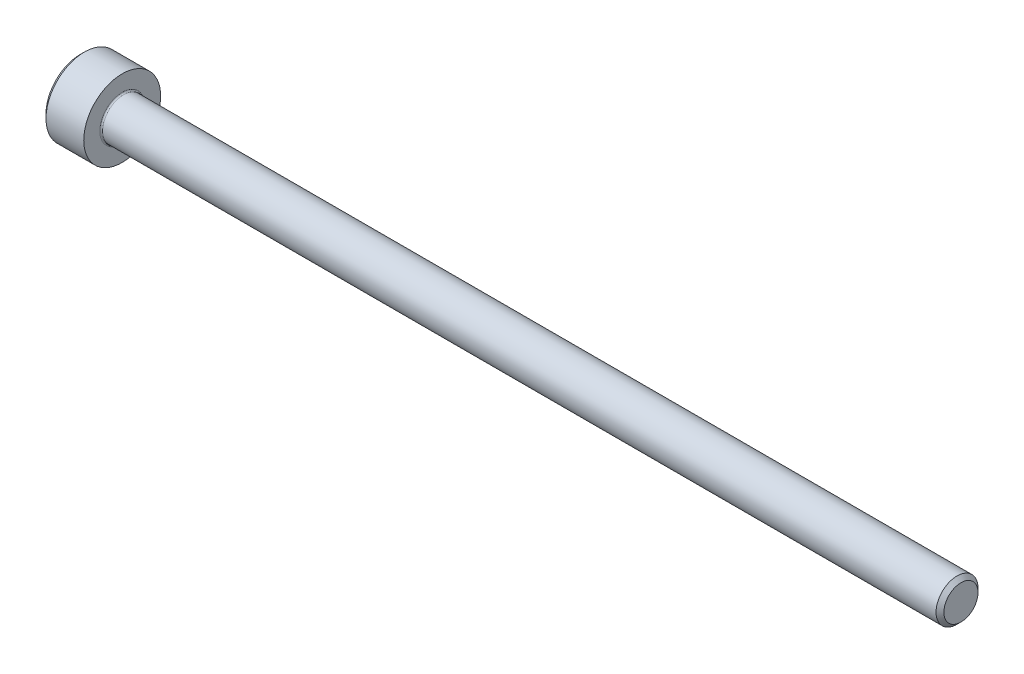
ISO-10303-21;
HEADER;
FILE_DESCRIPTION(('STEP AP214'),'2;1');
FILE_NAME('part.step','',(''),(''),'','','');
FILE_SCHEMA(('AUTOMOTIVE_DESIGN { 1 0 10303 214 1 1 1 1 }'));
ENDSEC;
DATA;
#1=APPLICATION_CONTEXT('core data for automotive mechanical design processes');
#2=APPLICATION_PROTOCOL_DEFINITION('international standard','automotive_design',2000,#1);
#3=PRODUCT_CONTEXT('',#1,'mechanical');
#4=PRODUCT('Part','Part','',(#3));
#5=PRODUCT_RELATED_PRODUCT_CATEGORY('part','',(#4));
#6=PRODUCT_DEFINITION_FORMATION('','',#4);
#7=PRODUCT_DEFINITION_CONTEXT('part definition',#1,'design');
#8=PRODUCT_DEFINITION('design','',#6,#7);
#9=PRODUCT_DEFINITION_SHAPE('','',#8);
#10=(LENGTH_UNIT() NAMED_UNIT(*) SI_UNIT(.MILLI.,.METRE.));
#11=(NAMED_UNIT(*) PLANE_ANGLE_UNIT() SI_UNIT($,.RADIAN.));
#12=(NAMED_UNIT(*) SI_UNIT($,.STERADIAN.) SOLID_ANGLE_UNIT());
#13=UNCERTAINTY_MEASURE_WITH_UNIT(LENGTH_MEASURE(1.E-05),#10,'distance_accuracy_value','');
#14=(GEOMETRIC_REPRESENTATION_CONTEXT(3) GLOBAL_UNCERTAINTY_ASSIGNED_CONTEXT((#13)) GLOBAL_UNIT_ASSIGNED_CONTEXT((#10,
#11,#12)) REPRESENTATION_CONTEXT('',''));
#15=CARTESIAN_POINT('',(0.,0.,0.));
#16=DIRECTION('',(0.,0.,1.));
#17=DIRECTION('',(1.,0.,0.));
#18=AXIS2_PLACEMENT_3D('',#15,#16,#17);
#19=CARTESIAN_POINT('',(0.,0.,0.));
#20=DIRECTION('',(-1.,0.,0.));
#21=DIRECTION('',(0.,0.,1.));
#22=AXIS2_PLACEMENT_3D('',#19,#20,#21);
#23=PLANE('',#22);
#24=DIRECTION('',(0.,-0.499999999999998,0.866025403784439));
#25=VECTOR('',#24,1.);
#26=CARTESIAN_POINT('',(0.,1.47801668912544,0.));
#27=LINE('',#26,#25);
#28=CARTESIAN_POINT('',(0.,1.47801668912544,0.));
#29=VERTEX_POINT('',#28);
#30=CARTESIAN_POINT('',(0.,0.73900834456272,1.28));
#31=VERTEX_POINT('',#30);
#32=EDGE_CURVE('E432',#29,#31,#27,.T.);
#33=ORIENTED_EDGE('',*,*,#32,.T.);
#34=DIRECTION('',(0.,1.,0.));
#35=VECTOR('',#34,1.);
#36=CARTESIAN_POINT('',(0.,-0.739008344562722,1.28));
#37=LINE('',#36,#35);
#38=CARTESIAN_POINT('',(0.,-0.739008344562722,1.28));
#39=VERTEX_POINT('',#38);
#40=EDGE_CURVE('E158',#39,#31,#37,.T.);
#41=ORIENTED_EDGE('',*,*,#40,.F.);
#42=DIRECTION('',(0.,-0.500000000000001,-0.866025403784438));
#43=VECTOR('',#42,1.);
#44=CARTESIAN_POINT('',(0.,-0.739008344562722,1.28));
#45=LINE('',#44,#43);
#46=CARTESIAN_POINT('',(0.,-1.47801668912544,0.));
#47=VERTEX_POINT('',#46);
#48=EDGE_CURVE('E437',#39,#47,#45,.T.);
#49=ORIENTED_EDGE('',*,*,#48,.T.);
#50=DIRECTION('',(0.,0.499999999999998,-0.86602540378444));
#51=VECTOR('',#50,1.);
#52=CARTESIAN_POINT('',(0.,-1.47801668912544,0.));
#53=LINE('',#52,#51);
#54=CARTESIAN_POINT('',(0.,-0.739008344562727,-1.28));
#55=VERTEX_POINT('',#54);
#56=EDGE_CURVE('E441',#47,#55,#53,.T.);
#57=ORIENTED_EDGE('',*,*,#56,.T.);
#58=DIRECTION('',(0.,-1.,0.));
#59=VECTOR('',#58,1.);
#60=CARTESIAN_POINT('',(0.,0.739008344562716,-1.28));
#61=LINE('',#60,#59);
#62=CARTESIAN_POINT('',(0.,0.739008344562716,-1.28));
#63=VERTEX_POINT('',#62);
#64=EDGE_CURVE('E445',#63,#55,#61,.T.);
#65=ORIENTED_EDGE('',*,*,#64,.F.);
#66=DIRECTION('',(0.,-0.500000000000001,-0.866025403784438));
#67=VECTOR('',#66,1.);
#68=CARTESIAN_POINT('',(0.,1.47801668912544,0.));
#69=LINE('',#68,#67);
#70=EDGE_CURVE('E153',#29,#63,#69,.T.);
#71=ORIENTED_EDGE('',*,*,#70,.F.);
#72=EDGE_LOOP('',(#33,#41,#49,#57,#65,#71));
#73=FACE_BOUND('',#72,.T.);
#74=CARTESIAN_POINT('',(0.,0.,0.));
#75=DIRECTION('',(-1.,0.,0.));
#76=DIRECTION('',(0.,0.,1.));
#77=AXIS2_PLACEMENT_3D('',#74,#75,#76);
#78=CIRCLE('',#77,2.45);
#79=CARTESIAN_POINT('',(0.,0.,2.45));
#80=VERTEX_POINT('',#79);
#81=EDGE_CURVE('E173',#80,#80,#78,.T.);
#82=ORIENTED_EDGE('',*,*,#81,.T.);
#83=EDGE_LOOP('',(#82));
#84=FACE_BOUND('',#83,.T.);
#85=ADVANCED_FACE('F40',(#73,#84),#23,.T.);
#86=CARTESIAN_POINT('',(63.,1.2195,0.));
#87=DIRECTION('',(1.,0.,0.));
#88=DIRECTION('',(0.,0.,-1.));
#89=AXIS2_PLACEMENT_3D('',#86,#87,#88);
#90=PLANE('',#89);
#91=CARTESIAN_POINT('',(63.,0.,0.));
#92=DIRECTION('',(-1.,0.,0.));
#93=DIRECTION('',(0.,0.,1.));
#94=AXIS2_PLACEMENT_3D('',#91,#92,#93);
#95=CIRCLE('',#94,1.2195);
#96=CARTESIAN_POINT('',(63.,0.,1.2195));
#97=VERTEX_POINT('',#96);
#98=EDGE_CURVE('E190',#97,#97,#95,.T.);
#99=ORIENTED_EDGE('',*,*,#98,.F.);
#100=EDGE_LOOP('',(#99));
#101=FACE_BOUND('',#100,.T.);
#102=ADVANCED_FACE('F213',(#101),#90,.T.);
#103=CARTESIAN_POINT('',(63.,0.,0.));
#104=DIRECTION('',(-1.,0.,0.));
#105=DIRECTION('',(0.,0.,1.));
#106=AXIS2_PLACEMENT_3D('',#103,#104,#105);
#107=CONICAL_SURFACE('',#106,1.2195,0.785398163396627);
#108=CARTESIAN_POINT('',(62.7194999999998,0.,0.));
#109=DIRECTION('',(-1.,0.,0.));
#110=DIRECTION('',(0.,0.,1.));
#111=AXIS2_PLACEMENT_3D('',#108,#109,#110);
#112=CIRCLE('',#111,1.49999999999976);
#113=CARTESIAN_POINT('',(62.7194999999998,0.,1.49999999999976));
#114=VERTEX_POINT('',#113);
#115=EDGE_CURVE('E186',#114,#114,#112,.T.);
#116=ORIENTED_EDGE('',*,*,#115,.F.);
#117=EDGE_LOOP('',(#116));
#118=FACE_BOUND('',#117,.T.);
#119=ORIENTED_EDGE('',*,*,#98,.T.);
#120=EDGE_LOOP('',(#119));
#121=FACE_BOUND('',#120,.T.);
#122=ADVANCED_FACE('F219',(#118,#121),#107,.T.);
#123=CARTESIAN_POINT('',(-31.75,0.,0.));
#124=DIRECTION('',(-1.,0.,0.));
#125=DIRECTION('',(0.,0.,1.));
#126=AXIS2_PLACEMENT_3D('',#123,#124,#125);
#127=CYLINDRICAL_SURFACE('',#126,1.49999999999988);
#128=CARTESIAN_POINT('',(3.1,0.,0.));
#129=DIRECTION('',(1.,0.,0.));
#130=DIRECTION('',(0.,0.,-1.));
#131=AXIS2_PLACEMENT_3D('',#128,#129,#130);
#132=CIRCLE('',#131,1.49999999999988);
#133=CARTESIAN_POINT('',(3.1,0.,-1.49999999999988));
#134=VERTEX_POINT('',#133);
#135=EDGE_CURVE('E11',#134,#134,#132,.T.);
#136=ORIENTED_EDGE('',*,*,#135,.T.);
#137=EDGE_LOOP('',(#136));
#138=FACE_BOUND('',#137,.T.);
#139=ORIENTED_EDGE('',*,*,#115,.T.);
#140=EDGE_LOOP('',(#139));
#141=FACE_BOUND('',#140,.T.);
#142=ADVANCED_FACE('F230',(#138,#141),#127,.T.);
#143=CARTESIAN_POINT('',(3.,2.75,0.));
#144=DIRECTION('',(1.,0.,0.));
#145=DIRECTION('',(0.,0.,-1.));
#146=AXIS2_PLACEMENT_3D('',#143,#144,#145);
#147=PLANE('',#146);
#148=CARTESIAN_POINT('',(3.,0.,0.));
#149=DIRECTION('',(1.,0.,0.));
#150=DIRECTION('',(0.,0.,-1.));
#151=AXIS2_PLACEMENT_3D('',#148,#149,#150);
#152=CIRCLE('',#151,1.59999999999988);
#153=CARTESIAN_POINT('',(3.,0.,-1.59999999999988));
#154=VERTEX_POINT('',#153);
#155=EDGE_CURVE('E49',#154,#154,#152,.F.);
#156=ORIENTED_EDGE('',*,*,#155,.T.);
#157=EDGE_LOOP('',(#156));
#158=FACE_BOUND('',#157,.T.);
#159=CARTESIAN_POINT('',(3.,0.,0.));
#160=DIRECTION('',(-1.,0.,0.));
#161=DIRECTION('',(0.,0.,1.));
#162=AXIS2_PLACEMENT_3D('',#159,#160,#161);
#163=CIRCLE('',#162,2.75);
#164=CARTESIAN_POINT('',(3.,0.,2.75));
#165=VERTEX_POINT('',#164);
#166=EDGE_CURVE('E182',#165,#165,#163,.T.);
#167=ORIENTED_EDGE('',*,*,#166,.F.);
#168=EDGE_LOOP('',(#167));
#169=FACE_BOUND('',#168,.T.);
#170=ADVANCED_FACE('F197',(#158,#169),#147,.T.);
#171=CARTESIAN_POINT('',(-31.75,0.,0.));
#172=DIRECTION('',(-1.,0.,0.));
#173=DIRECTION('',(0.,0.,1.));
#174=AXIS2_PLACEMENT_3D('',#171,#172,#173);
#175=CYLINDRICAL_SURFACE('',#174,2.75);
#176=ORIENTED_EDGE('',*,*,#166,.T.);
#177=EDGE_LOOP('',(#176));
#178=FACE_BOUND('',#177,.T.);
#179=CARTESIAN_POINT('',(0.300000000000002,0.,0.));
#180=DIRECTION('',(-1.,0.,0.));
#181=DIRECTION('',(0.,0.,1.));
#182=AXIS2_PLACEMENT_3D('',#179,#180,#181);
#183=CIRCLE('',#182,2.75);
#184=CARTESIAN_POINT('',(0.300000000000002,0.,2.75));
#185=VERTEX_POINT('',#184);
#186=EDGE_CURVE('E178',#185,#185,#183,.T.);
#187=ORIENTED_EDGE('',*,*,#186,.F.);
#188=EDGE_LOOP('',(#187));
#189=FACE_BOUND('',#188,.T.);
#190=ADVANCED_FACE('F208',(#178,#189),#175,.T.);
#191=CARTESIAN_POINT('',(0.,0.,0.));
#192=DIRECTION('',(1.,0.,0.));
#193=DIRECTION('',(0.,0.,-1.));
#194=AXIS2_PLACEMENT_3D('',#191,#192,#193);
#195=CONICAL_SURFACE('',#194,2.45,0.785398163397448);
#196=ORIENTED_EDGE('',*,*,#186,.T.);
#197=EDGE_LOOP('',(#196));
#198=FACE_BOUND('',#197,.T.);
#199=ORIENTED_EDGE('',*,*,#81,.F.);
#200=EDGE_LOOP('',(#199));
#201=FACE_BOUND('',#200,.T.);
#202=ADVANCED_FACE('F201',(#198,#201),#195,.T.);
#203=CARTESIAN_POINT('',(3.1,0.,0.));
#204=DIRECTION('',(1.,0.,0.));
#205=DIRECTION('',(0.,0.,-1.));
#206=AXIS2_PLACEMENT_3D('',#203,#204,#205);
#207=TOROIDAL_SURFACE('',#206,1.59999999999988,0.1);
#208=ORIENTED_EDGE('',*,*,#135,.F.);
#209=EDGE_LOOP('',(#208));
#210=FACE_BOUND('',#209,.T.);
#211=ORIENTED_EDGE('',*,*,#155,.F.);
#212=EDGE_LOOP('',(#211));
#213=FACE_BOUND('',#212,.T.);
#214=ADVANCED_FACE('F42',(#210,#213),#207,.F.);
#215=CARTESIAN_POINT('',(1.3,1.47801668912544,0.));
#216=DIRECTION('',(0.,-0.86602540378444,-0.499999999999999));
#217=DIRECTION('',(0.,0.499999999999999,-0.86602540378444));
#218=AXIS2_PLACEMENT_3D('',#215,#216,#217);
#219=PLANE('',#218);
#220=ORIENTED_EDGE('',*,*,#32,.F.);
#221=DIRECTION('',(-1.,0.,0.));
#222=VECTOR('',#221,1.);
#223=CARTESIAN_POINT('',(1.3,1.47801668912544,0.));
#224=LINE('',#223,#222);
#225=CARTESIAN_POINT('',(1.3,1.47801668912544,0.));
#226=VERTEX_POINT('',#225);
#227=EDGE_CURVE('E418',#226,#29,#224,.T.);
#228=ORIENTED_EDGE('',*,*,#227,.F.);
#229=DIRECTION('',(0.,-0.499999999999998,0.866025403784439));
#230=VECTOR('',#229,1.);
#231=CARTESIAN_POINT('',(1.3,1.47801668912544,0.));
#232=LINE('',#231,#230);
#233=CARTESIAN_POINT('',(1.3,1.10851251684408,0.639999999999996));
#234=VERTEX_POINT('',#233);
#235=EDGE_CURVE('E144',#226,#234,#232,.T.);
#236=ORIENTED_EDGE('',*,*,#235,.T.);
#237=CARTESIAN_POINT('',(1.3,0.73900834456272,1.28));
#238=VERTEX_POINT('',#237);
#239=EDGE_CURVE('E134',#234,#238,#232,.T.);
#240=ORIENTED_EDGE('',*,*,#239,.T.);
#241=DIRECTION('',(-1.,0.,0.));
#242=VECTOR('',#241,1.);
#243=CARTESIAN_POINT('',(1.3,0.73900834456272,1.28));
#244=LINE('',#243,#242);
#245=EDGE_CURVE('E149',#238,#31,#244,.T.);
#246=ORIENTED_EDGE('',*,*,#245,.T.);
#247=EDGE_LOOP('',(#220,#228,#236,#240,#246));
#248=FACE_BOUND('',#247,.T.);
#249=ADVANCED_FACE('F148',(#248),#219,.T.);
#250=CARTESIAN_POINT('',(1.3,-0.739008344562722,1.28));
#251=DIRECTION('',(0.,0.,1.));
#252=DIRECTION('',(0.,-1.,0.));
#253=AXIS2_PLACEMENT_3D('',#250,#251,#252);
#254=PLANE('',#253);
#255=ORIENTED_EDGE('',*,*,#40,.T.);
#256=ORIENTED_EDGE('',*,*,#245,.F.);
#257=DIRECTION('',(0.,1.,0.));
#258=VECTOR('',#257,1.);
#259=CARTESIAN_POINT('',(1.3,-0.739008344562722,1.28));
#260=LINE('',#259,#258);
#261=CARTESIAN_POINT('',(1.3,0.,1.28));
#262=VERTEX_POINT('',#261);
#263=EDGE_CURVE('E131',#262,#238,#260,.T.);
#264=ORIENTED_EDGE('',*,*,#263,.F.);
#265=CARTESIAN_POINT('',(1.3,-0.739008344562722,1.28));
#266=VERTEX_POINT('',#265);
#267=EDGE_CURVE('E143',#266,#262,#260,.T.);
#268=ORIENTED_EDGE('',*,*,#267,.F.);
#269=DIRECTION('',(-1.,0.,0.));
#270=VECTOR('',#269,1.);
#271=CARTESIAN_POINT('',(1.3,-0.739008344562722,1.28));
#272=LINE('',#271,#270);
#273=EDGE_CURVE('E161',#266,#39,#272,.T.);
#274=ORIENTED_EDGE('',*,*,#273,.T.);
#275=EDGE_LOOP('',(#255,#256,#264,#268,#274));
#276=FACE_BOUND('',#275,.T.);
#277=ADVANCED_FACE('F155',(#276),#254,.F.);
#278=CARTESIAN_POINT('',(1.3,-0.739008344562722,1.28));
#279=DIRECTION('',(0.,0.866025403784438,-0.500000000000001));
#280=DIRECTION('',(0.,0.500000000000001,0.866025403784438));
#281=AXIS2_PLACEMENT_3D('',#278,#279,#280);
#282=PLANE('',#281);
#283=ORIENTED_EDGE('',*,*,#48,.F.);
#284=ORIENTED_EDGE('',*,*,#273,.F.);
#285=DIRECTION('',(0.,-0.500000000000001,-0.866025403784438));
#286=VECTOR('',#285,1.);
#287=CARTESIAN_POINT('',(1.3,-0.739008344562722,1.28));
#288=LINE('',#287,#286);
#289=CARTESIAN_POINT('',(1.3,-1.10851251684408,0.640000000000002));
#290=VERTEX_POINT('',#289);
#291=EDGE_CURVE('E477',#266,#290,#288,.T.);
#292=ORIENTED_EDGE('',*,*,#291,.T.);
#293=CARTESIAN_POINT('',(1.3,-1.47801668912544,0.));
#294=VERTEX_POINT('',#293);
#295=EDGE_CURVE('E460',#290,#294,#288,.T.);
#296=ORIENTED_EDGE('',*,*,#295,.T.);
#297=DIRECTION('',(-1.,0.,0.));
#298=VECTOR('',#297,1.);
#299=CARTESIAN_POINT('',(1.3,-1.47801668912544,0.));
#300=LINE('',#299,#298);
#301=EDGE_CURVE('E168',#294,#47,#300,.T.);
#302=ORIENTED_EDGE('',*,*,#301,.T.);
#303=EDGE_LOOP('',(#283,#284,#292,#296,#302));
#304=FACE_BOUND('',#303,.T.);
#305=ADVANCED_FACE('F307',(#304),#282,.T.);
#306=CARTESIAN_POINT('',(1.3,-1.47801668912544,0.));
#307=DIRECTION('',(0.,0.86602540378444,0.499999999999998));
#308=DIRECTION('',(0.,-0.499999999999998,0.86602540378444));
#309=AXIS2_PLACEMENT_3D('',#306,#307,#308);
#310=PLANE('',#309);
#311=ORIENTED_EDGE('',*,*,#56,.F.);
#312=ORIENTED_EDGE('',*,*,#301,.F.);
#313=DIRECTION('',(0.,0.499999999999998,-0.86602540378444));
#314=VECTOR('',#313,1.);
#315=CARTESIAN_POINT('',(1.3,-1.47801668912544,0.));
#316=LINE('',#315,#314);
#317=CARTESIAN_POINT('',(1.3,-1.10851251684409,-0.64));
#318=VERTEX_POINT('',#317);
#319=EDGE_CURVE('E427',#294,#318,#316,.T.);
#320=ORIENTED_EDGE('',*,*,#319,.T.);
#321=CARTESIAN_POINT('',(1.3,-0.739008344562727,-1.28));
#322=VERTEX_POINT('',#321);
#323=EDGE_CURVE('E475',#318,#322,#316,.T.);
#324=ORIENTED_EDGE('',*,*,#323,.T.);
#325=DIRECTION('',(-1.,0.,0.));
#326=VECTOR('',#325,1.);
#327=CARTESIAN_POINT('',(1.3,-0.739008344562727,-1.28));
#328=LINE('',#327,#326);
#329=EDGE_CURVE('E417',#322,#55,#328,.T.);
#330=ORIENTED_EDGE('',*,*,#329,.T.);
#331=EDGE_LOOP('',(#311,#312,#320,#324,#330));
#332=FACE_BOUND('',#331,.T.);
#333=ADVANCED_FACE('F315',(#332),#310,.T.);
#334=CARTESIAN_POINT('',(1.3,0.739008344562716,-1.28));
#335=DIRECTION('',(0.,0.,-1.));
#336=DIRECTION('',(0.,1.,0.));
#337=AXIS2_PLACEMENT_3D('',#334,#335,#336);
#338=PLANE('',#337);
#339=ORIENTED_EDGE('',*,*,#64,.T.);
#340=ORIENTED_EDGE('',*,*,#329,.F.);
#341=DIRECTION('',(0.,-1.,0.));
#342=VECTOR('',#341,1.);
#343=CARTESIAN_POINT('',(1.3,0.739008344562716,-1.28));
#344=LINE('',#343,#342);
#345=CARTESIAN_POINT('',(1.3,0.,-1.28));
#346=VERTEX_POINT('',#345);
#347=EDGE_CURVE('E421',#346,#322,#344,.T.);
#348=ORIENTED_EDGE('',*,*,#347,.F.);
#349=CARTESIAN_POINT('',(1.3,0.739008344562716,-1.28));
#350=VERTEX_POINT('',#349);
#351=EDGE_CURVE('E59',#350,#346,#344,.T.);
#352=ORIENTED_EDGE('',*,*,#351,.F.);
#353=DIRECTION('',(-1.,0.,0.));
#354=VECTOR('',#353,1.);
#355=CARTESIAN_POINT('',(1.3,0.739008344562716,-1.28));
#356=LINE('',#355,#354);
#357=EDGE_CURVE('E413',#350,#63,#356,.T.);
#358=ORIENTED_EDGE('',*,*,#357,.T.);
#359=EDGE_LOOP('',(#339,#340,#348,#352,#358));
#360=FACE_BOUND('',#359,.T.);
#361=ADVANCED_FACE('F324',(#360),#338,.F.);
#362=CARTESIAN_POINT('',(1.3,1.47801668912544,0.));
#363=DIRECTION('',(0.,0.866025403784438,-0.500000000000001));
#364=DIRECTION('',(0.,0.500000000000001,0.866025403784438));
#365=AXIS2_PLACEMENT_3D('',#362,#363,#364);
#366=PLANE('',#365);
#367=ORIENTED_EDGE('',*,*,#70,.T.);
#368=ORIENTED_EDGE('',*,*,#357,.F.);
#369=DIRECTION('',(0.,-0.500000000000001,-0.866025403784438));
#370=VECTOR('',#369,1.);
#371=CARTESIAN_POINT('',(1.3,1.47801668912544,0.));
#372=LINE('',#371,#370);
#373=CARTESIAN_POINT('',(1.3,1.10851251684408,-0.64));
#374=VERTEX_POINT('',#373);
#375=EDGE_CURVE('E402',#374,#350,#372,.T.);
#376=ORIENTED_EDGE('',*,*,#375,.F.);
#377=EDGE_CURVE('E409',#226,#374,#372,.T.);
#378=ORIENTED_EDGE('',*,*,#377,.F.);
#379=ORIENTED_EDGE('',*,*,#227,.T.);
#380=EDGE_LOOP('',(#367,#368,#376,#378,#379));
#381=FACE_BOUND('',#380,.T.);
#382=ADVANCED_FACE('F333',(#381),#366,.F.);
#383=CARTESIAN_POINT('',(1.3,2.21702503368816,-1.28));
#384=DIRECTION('',(1.,0.,0.));
#385=DIRECTION('',(0.,0.,-1.));
#386=AXIS2_PLACEMENT_3D('',#383,#384,#385);
#387=PLANE('',#386);
#388=ORIENTED_EDGE('',*,*,#347,.T.);
#389=ORIENTED_EDGE('',*,*,#323,.F.);
#390=CARTESIAN_POINT('',(1.3,0.,0.));
#391=DIRECTION('',(-1.,0.,0.));
#392=DIRECTION('',(0.,0.,1.));
#393=AXIS2_PLACEMENT_3D('',#390,#391,#392);
#394=CIRCLE('',#393,1.28);
#395=EDGE_CURVE('E468',#346,#318,#394,.T.);
#396=ORIENTED_EDGE('',*,*,#395,.F.);
#397=EDGE_LOOP('',(#388,#389,#396));
#398=FACE_BOUND('',#397,.T.);
#399=ADVANCED_FACE('F342',(#398),#387,.F.);
#400=ORIENTED_EDGE('',*,*,#319,.F.);
#401=ORIENTED_EDGE('',*,*,#295,.F.);
#402=EDGE_CURVE('E165',#318,#290,#394,.T.);
#403=ORIENTED_EDGE('',*,*,#402,.F.);
#404=EDGE_LOOP('',(#400,#401,#403));
#405=FACE_BOUND('',#404,.T.);
#406=ADVANCED_FACE('F351',(#405),#387,.F.);
#407=ORIENTED_EDGE('',*,*,#291,.F.);
#408=ORIENTED_EDGE('',*,*,#267,.T.);
#409=EDGE_CURVE('E160',#290,#262,#394,.T.);
#410=ORIENTED_EDGE('',*,*,#409,.F.);
#411=EDGE_LOOP('',(#407,#408,#410));
#412=FACE_BOUND('',#411,.T.);
#413=ADVANCED_FACE('F360',(#412),#387,.F.);
#414=ORIENTED_EDGE('',*,*,#263,.T.);
#415=ORIENTED_EDGE('',*,*,#239,.F.);
#416=EDGE_CURVE('E137',#262,#234,#394,.T.);
#417=ORIENTED_EDGE('',*,*,#416,.F.);
#418=EDGE_LOOP('',(#414,#415,#417));
#419=FACE_BOUND('',#418,.T.);
#420=ADVANCED_FACE('F133',(#419),#387,.F.);
#421=ORIENTED_EDGE('',*,*,#235,.F.);
#422=ORIENTED_EDGE('',*,*,#377,.T.);
#423=EDGE_CURVE('E174',#234,#374,#394,.T.);
#424=ORIENTED_EDGE('',*,*,#423,.F.);
#425=EDGE_LOOP('',(#421,#422,#424));
#426=FACE_BOUND('',#425,.T.);
#427=ADVANCED_FACE('F375',(#426),#387,.F.);
#428=ORIENTED_EDGE('',*,*,#375,.T.);
#429=ORIENTED_EDGE('',*,*,#351,.T.);
#430=EDGE_CURVE('E405',#374,#346,#394,.T.);
#431=ORIENTED_EDGE('',*,*,#430,.F.);
#432=EDGE_LOOP('',(#428,#429,#431));
#433=FACE_BOUND('',#432,.T.);
#434=ADVANCED_FACE('F290',(#433),#387,.F.);
#435=CARTESIAN_POINT('',(1.3,0.,0.));
#436=DIRECTION('',(-1.,0.,0.));
#437=DIRECTION('',(0.,0.,1.));
#438=AXIS2_PLACEMENT_3D('',#435,#436,#437);
#439=CONICAL_SURFACE('',#438,1.28,1.0471975511966);
#440=CARTESIAN_POINT('',(2.03900834456273,0.,0.));
#441=VERTEX_POINT('',#440);
#442=VERTEX_LOOP('',#441);
#443=FACE_BOUND('',#442,.T.);
#444=ORIENTED_EDGE('',*,*,#416,.T.);
#445=ORIENTED_EDGE('',*,*,#423,.T.);
#446=ORIENTED_EDGE('',*,*,#430,.T.);
#447=ORIENTED_EDGE('',*,*,#395,.T.);
#448=ORIENTED_EDGE('',*,*,#402,.T.);
#449=ORIENTED_EDGE('',*,*,#409,.T.);
#450=EDGE_LOOP('',(#444,#445,#446,#447,#448,#449));
#451=FACE_BOUND('',#450,.T.);
#452=ADVANCED_FACE('F223',(#443,#451),#439,.F.);
#453=CLOSED_SHELL('',(#85,#102,#122,#142,#170,#190,#202,#214,#249,#277,#305,#333,#361,#382,#399,
#406,#413,#420,#427,#434,#452));
#454=MANIFOLD_SOLID_BREP('B2',#453);
#455=ADVANCED_BREP_SHAPE_REPRESENTATION('',(#18,#454),#14);
#456=SHAPE_DEFINITION_REPRESENTATION(#9,#455);
ENDSEC;
END-ISO-10303-21;
